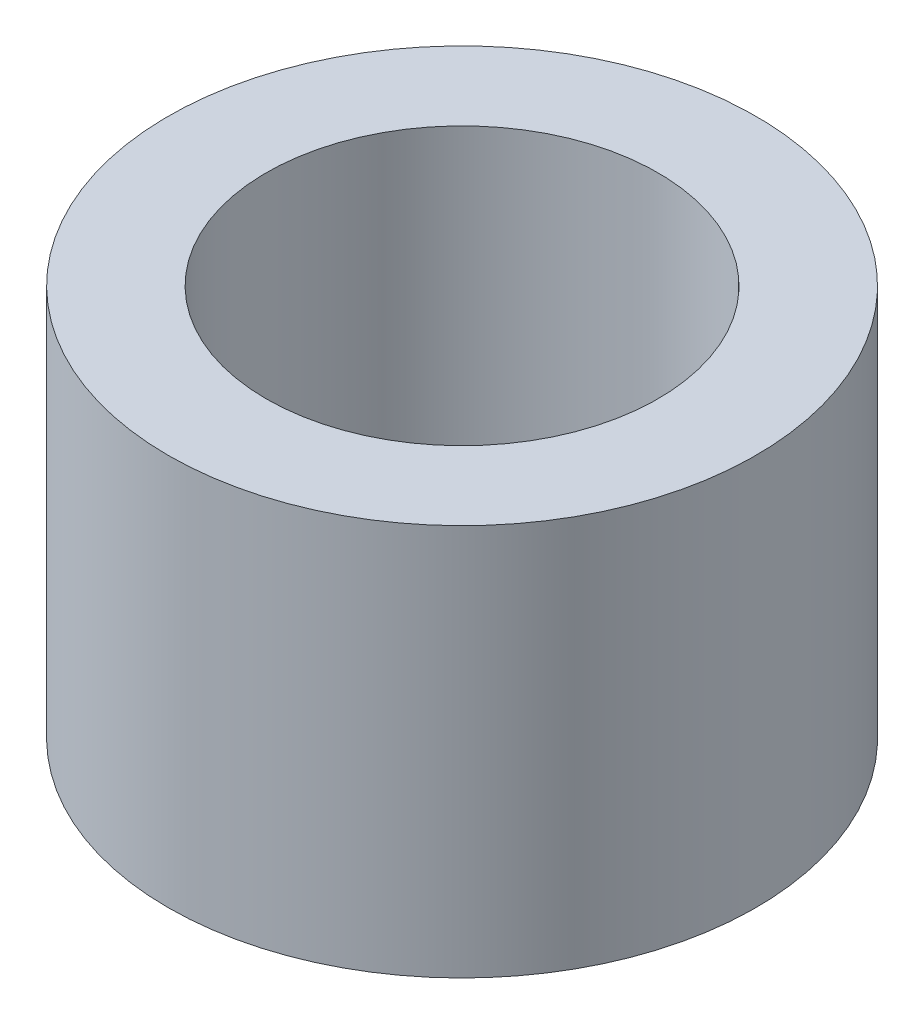
ISO-10303-21;
HEADER;
FILE_DESCRIPTION(('STEP AP214'),'2;1');
FILE_NAME('part.step','',(''),(''),'','','');
FILE_SCHEMA(('AUTOMOTIVE_DESIGN { 1 0 10303 214 1 1 1 1 }'));
ENDSEC;
DATA;
#1=APPLICATION_CONTEXT('core data for automotive mechanical design processes');
#2=APPLICATION_PROTOCOL_DEFINITION('international standard','automotive_design',2000,#1);
#3=PRODUCT_CONTEXT('',#1,'mechanical');
#4=PRODUCT('Part','Part','',(#3));
#5=PRODUCT_RELATED_PRODUCT_CATEGORY('part','',(#4));
#6=PRODUCT_DEFINITION_FORMATION('','',#4);
#7=PRODUCT_DEFINITION_CONTEXT('part definition',#1,'design');
#8=PRODUCT_DEFINITION('design','',#6,#7);
#9=PRODUCT_DEFINITION_SHAPE('','',#8);
#10=(LENGTH_UNIT() NAMED_UNIT(*) SI_UNIT(.MILLI.,.METRE.));
#11=(NAMED_UNIT(*) PLANE_ANGLE_UNIT() SI_UNIT($,.RADIAN.));
#12=(NAMED_UNIT(*) SI_UNIT($,.STERADIAN.) SOLID_ANGLE_UNIT());
#13=UNCERTAINTY_MEASURE_WITH_UNIT(LENGTH_MEASURE(1.E-05),#10,'distance_accuracy_value','');
#14=(GEOMETRIC_REPRESENTATION_CONTEXT(3) GLOBAL_UNCERTAINTY_ASSIGNED_CONTEXT((#13)) GLOBAL_UNIT_ASSIGNED_CONTEXT((#10,
#11,#12)) REPRESENTATION_CONTEXT('',''));
#15=CARTESIAN_POINT('',(0.,0.,0.));
#16=DIRECTION('',(0.,0.,1.));
#17=DIRECTION('',(1.,0.,0.));
#18=AXIS2_PLACEMENT_3D('',#15,#16,#17);
#19=CARTESIAN_POINT('',(0.,2.,0.));
#20=DIRECTION('',(0.,-1.,0.));
#21=DIRECTION('',(0.,0.,-1.));
#22=AXIS2_PLACEMENT_3D('',#19,#20,#21);
#23=CYLINDRICAL_SURFACE('',#22,1.);
#24=CARTESIAN_POINT('',(0.,2.,0.));
#25=DIRECTION('',(0.,1.,0.));
#26=DIRECTION('',(0.,0.,1.));
#27=AXIS2_PLACEMENT_3D('',#24,#25,#26);
#28=CIRCLE('',#27,1.);
#29=CARTESIAN_POINT('',(0.,2.,1.));
#30=VERTEX_POINT('',#29);
#31=EDGE_CURVE('E53',#30,#30,#28,.T.);
#32=ORIENTED_EDGE('',*,*,#31,.T.);
#33=EDGE_LOOP('',(#32));
#34=FACE_BOUND('',#33,.T.);
#35=CARTESIAN_POINT('',(0.,0.,0.));
#36=DIRECTION('',(0.,1.,0.));
#37=DIRECTION('',(0.,0.,1.));
#38=AXIS2_PLACEMENT_3D('',#35,#36,#37);
#39=CIRCLE('',#38,1.);
#40=CARTESIAN_POINT('',(0.,0.,1.));
#41=VERTEX_POINT('',#40);
#42=EDGE_CURVE('E60',#41,#41,#39,.T.);
#43=ORIENTED_EDGE('',*,*,#42,.F.);
#44=EDGE_LOOP('',(#43));
#45=FACE_BOUND('',#44,.T.);
#46=ADVANCED_FACE('F45',(#34,#45),#23,.F.);
#47=CARTESIAN_POINT('',(0.,2.,0.));
#48=DIRECTION('',(0.,-1.,0.));
#49=DIRECTION('',(0.,0.,-1.));
#50=AXIS2_PLACEMENT_3D('',#47,#48,#49);
#51=CYLINDRICAL_SURFACE('',#50,1.5);
#52=CARTESIAN_POINT('',(0.,2.,0.));
#53=DIRECTION('',(0.,1.,0.));
#54=DIRECTION('',(0.,0.,1.));
#55=AXIS2_PLACEMENT_3D('',#52,#53,#54);
#56=CIRCLE('',#55,1.5);
#57=CARTESIAN_POINT('',(0.,2.,1.5));
#58=VERTEX_POINT('',#57);
#59=EDGE_CURVE('E10',#58,#58,#56,.T.);
#60=ORIENTED_EDGE('',*,*,#59,.F.);
#61=EDGE_LOOP('',(#60));
#62=FACE_BOUND('',#61,.T.);
#63=CARTESIAN_POINT('',(0.,0.,0.));
#64=DIRECTION('',(0.,1.,0.));
#65=DIRECTION('',(0.,0.,1.));
#66=AXIS2_PLACEMENT_3D('',#63,#64,#65);
#67=CIRCLE('',#66,1.5);
#68=CARTESIAN_POINT('',(0.,0.,1.5));
#69=VERTEX_POINT('',#68);
#70=EDGE_CURVE('E48',#69,#69,#67,.T.);
#71=ORIENTED_EDGE('',*,*,#70,.T.);
#72=EDGE_LOOP('',(#71));
#73=FACE_BOUND('',#72,.T.);
#74=ADVANCED_FACE('F69',(#62,#73),#51,.T.);
#75=CARTESIAN_POINT('',(0.,2.,0.));
#76=DIRECTION('',(0.,1.,0.));
#77=DIRECTION('',(0.,0.,1.));
#78=AXIS2_PLACEMENT_3D('',#75,#76,#77);
#79=PLANE('',#78);
#80=ORIENTED_EDGE('',*,*,#31,.F.);
#81=EDGE_LOOP('',(#80));
#82=FACE_BOUND('',#81,.T.);
#83=ORIENTED_EDGE('',*,*,#59,.T.);
#84=EDGE_LOOP('',(#83));
#85=FACE_BOUND('',#84,.T.);
#86=ADVANCED_FACE('F73',(#82,#85),#79,.T.);
#87=CARTESIAN_POINT('',(0.,0.,0.));
#88=DIRECTION('',(0.,1.,0.));
#89=DIRECTION('',(0.,0.,1.));
#90=AXIS2_PLACEMENT_3D('',#87,#88,#89);
#91=PLANE('',#90);
#92=ORIENTED_EDGE('',*,*,#42,.T.);
#93=EDGE_LOOP('',(#92));
#94=FACE_BOUND('',#93,.T.);
#95=ORIENTED_EDGE('',*,*,#70,.F.);
#96=EDGE_LOOP('',(#95));
#97=FACE_BOUND('',#96,.T.);
#98=ADVANCED_FACE('F71',(#94,#97),#91,.F.);
#99=CLOSED_SHELL('',(#46,#74,#86,#98));
#100=MANIFOLD_SOLID_BREP('B2',#99);
#101=ADVANCED_BREP_SHAPE_REPRESENTATION('',(#18,#100),#14);
#102=SHAPE_DEFINITION_REPRESENTATION(#9,#101);
ENDSEC;
END-ISO-10303-21;
